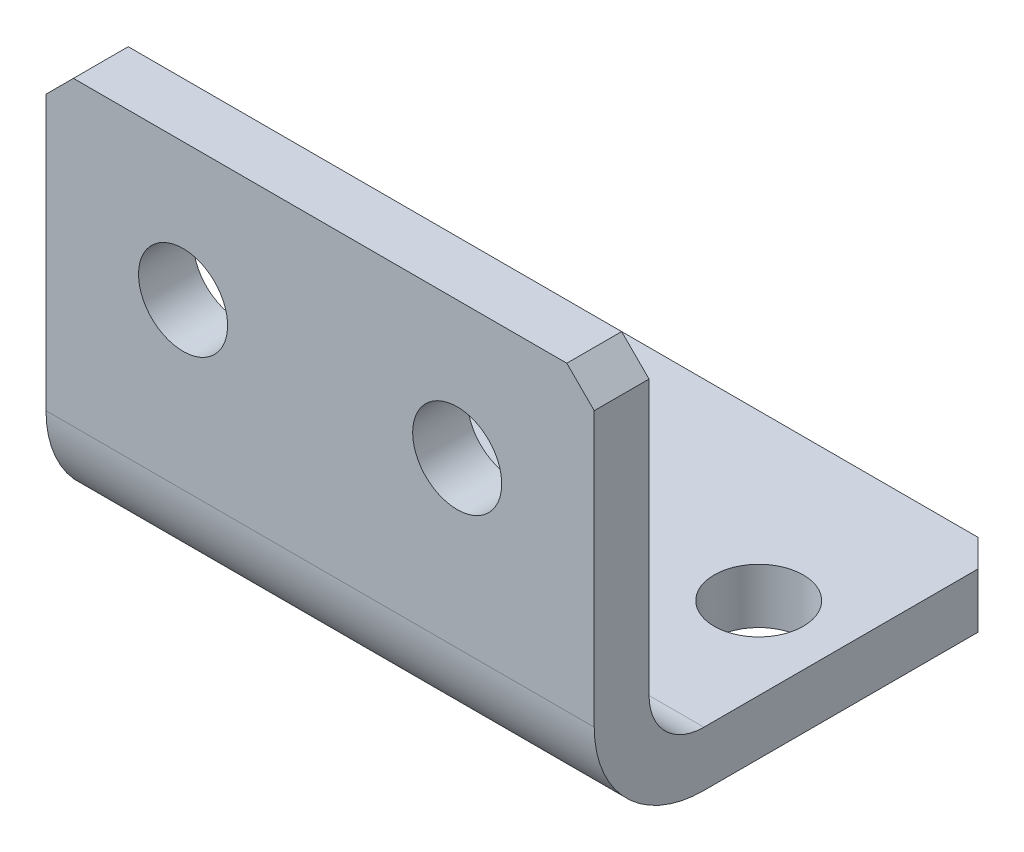
ISO-10303-21;
HEADER;
FILE_DESCRIPTION(('STEP AP214'),'2;1');
FILE_NAME('part.step','',(''),(''),'','','');
FILE_SCHEMA(('AUTOMOTIVE_DESIGN { 1 0 10303 214 1 1 1 1 }'));
ENDSEC;
DATA;
#1=APPLICATION_CONTEXT('core data for automotive mechanical design processes');
#2=APPLICATION_PROTOCOL_DEFINITION('international standard','automotive_design',2000,#1);
#3=PRODUCT_CONTEXT('',#1,'mechanical');
#4=PRODUCT('Part','Part','',(#3));
#5=PRODUCT_RELATED_PRODUCT_CATEGORY('part','',(#4));
#6=PRODUCT_DEFINITION_FORMATION('','',#4);
#7=PRODUCT_DEFINITION_CONTEXT('part definition',#1,'design');
#8=PRODUCT_DEFINITION('design','',#6,#7);
#9=PRODUCT_DEFINITION_SHAPE('','',#8);
#10=(LENGTH_UNIT() NAMED_UNIT(*) SI_UNIT(.MILLI.,.METRE.));
#11=(NAMED_UNIT(*) PLANE_ANGLE_UNIT() SI_UNIT($,.RADIAN.));
#12=(NAMED_UNIT(*) SI_UNIT($,.STERADIAN.) SOLID_ANGLE_UNIT());
#13=UNCERTAINTY_MEASURE_WITH_UNIT(LENGTH_MEASURE(1.E-05),#10,'distance_accuracy_value','');
#14=(GEOMETRIC_REPRESENTATION_CONTEXT(3) GLOBAL_UNCERTAINTY_ASSIGNED_CONTEXT((#13)) GLOBAL_UNIT_ASSIGNED_CONTEXT((#10,
#11,#12)) REPRESENTATION_CONTEXT('',''));
#15=CARTESIAN_POINT('',(0.,0.,0.));
#16=DIRECTION('',(0.,0.,1.));
#17=DIRECTION('',(1.,0.,0.));
#18=AXIS2_PLACEMENT_3D('',#15,#16,#17);
#19=CARTESIAN_POINT('',(20.,0.,-8.));
#20=DIRECTION('',(0.,1.,0.));
#21=DIRECTION('',(0.,0.,1.));
#22=AXIS2_PLACEMENT_3D('',#19,#20,#21);
#23=PLANE('',#22);
#24=CARTESIAN_POINT('',(-14.,0.,-18.));
#25=DIRECTION('',(0.,1.,0.));
#26=DIRECTION('',(0.,0.,1.));
#27=AXIS2_PLACEMENT_3D('',#24,#25,#26);
#28=CIRCLE('',#27,3.25);
#29=CARTESIAN_POINT('',(-14.,0.,-14.75));
#30=VERTEX_POINT('',#29);
#31=EDGE_CURVE('E202',#30,#30,#28,.T.);
#32=ORIENTED_EDGE('',*,*,#31,.T.);
#33=EDGE_LOOP('',(#32));
#34=FACE_BOUND('',#33,.T.);
#35=CARTESIAN_POINT('',(14.,0.,-18.));
#36=DIRECTION('',(0.,1.,0.));
#37=DIRECTION('',(0.,0.,1.));
#38=AXIS2_PLACEMENT_3D('',#35,#36,#37);
#39=CIRCLE('',#38,3.25);
#40=CARTESIAN_POINT('',(14.,0.,-14.75));
#41=VERTEX_POINT('',#40);
#42=EDGE_CURVE('E191',#41,#41,#39,.T.);
#43=ORIENTED_EDGE('',*,*,#42,.T.);
#44=EDGE_LOOP('',(#43));
#45=FACE_BOUND('',#44,.T.);
#46=DIRECTION('',(0.707106781186548,0.,-0.707106781186547));
#47=VECTOR('',#46,1.);
#48=CARTESIAN_POINT('',(-20.,0.,-28.));
#49=LINE('',#48,#47);
#50=CARTESIAN_POINT('',(-20.,0.,-28.));
#51=VERTEX_POINT('',#50);
#52=CARTESIAN_POINT('',(-18.,0.,-30.));
#53=VERTEX_POINT('',#52);
#54=EDGE_CURVE('E129',#51,#53,#49,.T.);
#55=ORIENTED_EDGE('',*,*,#54,.T.);
#56=DIRECTION('',(-1.,0.,0.));
#57=VECTOR('',#56,1.);
#58=CARTESIAN_POINT('',(20.,0.,-30.));
#59=LINE('',#58,#57);
#60=CARTESIAN_POINT('',(18.,0.,-30.));
#61=VERTEX_POINT('',#60);
#62=EDGE_CURVE('E42',#61,#53,#59,.T.);
#63=ORIENTED_EDGE('',*,*,#62,.F.);
#64=DIRECTION('',(0.707106781186548,0.,0.707106781186547));
#65=VECTOR('',#64,1.);
#66=CARTESIAN_POINT('',(18.,0.,-30.));
#67=LINE('',#66,#65);
#68=CARTESIAN_POINT('',(20.,0.,-28.));
#69=VERTEX_POINT('',#68);
#70=EDGE_CURVE('E143',#61,#69,#67,.T.);
#71=ORIENTED_EDGE('',*,*,#70,.T.);
#72=DIRECTION('',(0.,0.,-1.));
#73=VECTOR('',#72,1.);
#74=CARTESIAN_POINT('',(20.,0.,-8.));
#75=LINE('',#74,#73);
#76=CARTESIAN_POINT('',(20.,0.,-8.));
#77=VERTEX_POINT('',#76);
#78=EDGE_CURVE('E163',#77,#69,#75,.T.);
#79=ORIENTED_EDGE('',*,*,#78,.F.);
#80=DIRECTION('',(-1.,0.,0.));
#81=VECTOR('',#80,1.);
#82=CARTESIAN_POINT('',(20.,0.,-8.));
#83=LINE('',#82,#81);
#84=CARTESIAN_POINT('',(-20.,0.,-8.));
#85=VERTEX_POINT('',#84);
#86=EDGE_CURVE('E11',#77,#85,#83,.T.);
#87=ORIENTED_EDGE('',*,*,#86,.T.);
#88=DIRECTION('',(0.,0.,-1.));
#89=VECTOR('',#88,1.);
#90=CARTESIAN_POINT('',(-20.,0.,-8.));
#91=LINE('',#90,#89);
#92=EDGE_CURVE('E57',#85,#51,#91,.T.);
#93=ORIENTED_EDGE('',*,*,#92,.T.);
#94=EDGE_LOOP('',(#55,#63,#71,#79,#87,#93));
#95=FACE_BOUND('',#94,.T.);
#96=ADVANCED_FACE('F33',(#34,#45,#95),#23,.F.);
#97=CARTESIAN_POINT('',(20.,0.,-30.));
#98=DIRECTION('',(0.,0.,1.));
#99=DIRECTION('',(1.,0.,0.));
#100=AXIS2_PLACEMENT_3D('',#97,#98,#99);
#101=PLANE('',#100);
#102=DIRECTION('',(0.,-1.,0.));
#103=VECTOR('',#102,1.);
#104=CARTESIAN_POINT('',(-18.,4.,-30.));
#105=LINE('',#104,#103);
#106=CARTESIAN_POINT('',(-18.,4.,-30.));
#107=VERTEX_POINT('',#106);
#108=EDGE_CURVE('E133',#107,#53,#105,.T.);
#109=ORIENTED_EDGE('',*,*,#108,.F.);
#110=DIRECTION('',(-1.,0.,0.));
#111=VECTOR('',#110,1.);
#112=CARTESIAN_POINT('',(20.,4.,-30.));
#113=LINE('',#112,#111);
#114=CARTESIAN_POINT('',(18.,4.,-30.));
#115=VERTEX_POINT('',#114);
#116=EDGE_CURVE('E142',#115,#107,#113,.T.);
#117=ORIENTED_EDGE('',*,*,#116,.F.);
#118=DIRECTION('',(0.,-1.,0.));
#119=VECTOR('',#118,1.);
#120=CARTESIAN_POINT('',(18.,4.,-30.));
#121=LINE('',#120,#119);
#122=EDGE_CURVE('E219',#115,#61,#121,.T.);
#123=ORIENTED_EDGE('',*,*,#122,.T.);
#124=ORIENTED_EDGE('',*,*,#62,.T.);
#125=EDGE_LOOP('',(#109,#117,#123,#124));
#126=FACE_BOUND('',#125,.T.);
#127=ADVANCED_FACE('F275',(#126),#101,.F.);
#128=CARTESIAN_POINT('',(20.,4.,-30.));
#129=DIRECTION('',(0.,-1.,0.));
#130=DIRECTION('',(0.,0.,-1.));
#131=AXIS2_PLACEMENT_3D('',#128,#129,#130);
#132=PLANE('',#131);
#133=CARTESIAN_POINT('',(-14.,4.,-18.));
#134=DIRECTION('',(0.,-1.,0.));
#135=DIRECTION('',(0.,0.,-1.));
#136=AXIS2_PLACEMENT_3D('',#133,#134,#135);
#137=CIRCLE('',#136,3.25);
#138=CARTESIAN_POINT('',(-14.,4.,-21.25));
#139=VERTEX_POINT('',#138);
#140=EDGE_CURVE('E37',#139,#139,#137,.F.);
#141=ORIENTED_EDGE('',*,*,#140,.F.);
#142=EDGE_LOOP('',(#141));
#143=FACE_BOUND('',#142,.T.);
#144=CARTESIAN_POINT('',(14.,4.,-18.));
#145=DIRECTION('',(0.,-1.,0.));
#146=DIRECTION('',(0.,0.,-1.));
#147=AXIS2_PLACEMENT_3D('',#144,#145,#146);
#148=CIRCLE('',#147,3.25);
#149=CARTESIAN_POINT('',(14.,4.,-21.25));
#150=VERTEX_POINT('',#149);
#151=EDGE_CURVE('E188',#150,#150,#148,.F.);
#152=ORIENTED_EDGE('',*,*,#151,.F.);
#153=EDGE_LOOP('',(#152));
#154=FACE_BOUND('',#153,.T.);
#155=DIRECTION('',(0.707106781186548,0.,-0.707106781186547));
#156=VECTOR('',#155,1.);
#157=CARTESIAN_POINT('',(-20.,4.,-28.));
#158=LINE('',#157,#156);
#159=CARTESIAN_POINT('',(-20.,4.,-28.));
#160=VERTEX_POINT('',#159);
#161=EDGE_CURVE('E127',#160,#107,#158,.T.);
#162=ORIENTED_EDGE('',*,*,#161,.F.);
#163=DIRECTION('',(0.,0.,1.));
#164=VECTOR('',#163,1.);
#165=CARTESIAN_POINT('',(-20.,4.,-30.));
#166=LINE('',#165,#164);
#167=CARTESIAN_POINT('',(-20.,4.,-8.));
#168=VERTEX_POINT('',#167);
#169=EDGE_CURVE('E139',#160,#168,#166,.T.);
#170=ORIENTED_EDGE('',*,*,#169,.T.);
#171=DIRECTION('',(-1.,0.,0.));
#172=VECTOR('',#171,1.);
#173=CARTESIAN_POINT('',(20.,4.,-8.));
#174=LINE('',#173,#172);
#175=CARTESIAN_POINT('',(20.,4.,-8.));
#176=VERTEX_POINT('',#175);
#177=EDGE_CURVE('E184',#176,#168,#174,.T.);
#178=ORIENTED_EDGE('',*,*,#177,.F.);
#179=DIRECTION('',(0.,0.,1.));
#180=VECTOR('',#179,1.);
#181=CARTESIAN_POINT('',(20.,4.,-30.));
#182=LINE('',#181,#180);
#183=CARTESIAN_POINT('',(20.,4.,-28.));
#184=VERTEX_POINT('',#183);
#185=EDGE_CURVE('E165',#184,#176,#182,.T.);
#186=ORIENTED_EDGE('',*,*,#185,.F.);
#187=DIRECTION('',(0.707106781186548,0.,0.707106781186547));
#188=VECTOR('',#187,1.);
#189=CARTESIAN_POINT('',(18.,4.,-30.));
#190=LINE('',#189,#188);
#191=EDGE_CURVE('E50',#115,#184,#190,.T.);
#192=ORIENTED_EDGE('',*,*,#191,.F.);
#193=ORIENTED_EDGE('',*,*,#116,.T.);
#194=EDGE_LOOP('',(#162,#170,#178,#186,#192,#193));
#195=FACE_BOUND('',#194,.T.);
#196=ADVANCED_FACE('F137',(#143,#154,#195),#132,.F.);
#197=CARTESIAN_POINT('',(20.,7.99999999999993,-7.99999999999993));
#198=DIRECTION('',(1.,0.,0.));
#199=DIRECTION('',(0.,0.,-1.));
#200=AXIS2_PLACEMENT_3D('',#197,#198,#199);
#201=PLANE('',#200);
#202=ORIENTED_EDGE('',*,*,#78,.T.);
#203=DIRECTION('',(0.,-1.,0.));
#204=VECTOR('',#203,1.);
#205=CARTESIAN_POINT('',(20.,4.,-28.));
#206=LINE('',#205,#204);
#207=EDGE_CURVE('E214',#184,#69,#206,.T.);
#208=ORIENTED_EDGE('',*,*,#207,.F.);
#209=ORIENTED_EDGE('',*,*,#185,.T.);
#210=CARTESIAN_POINT('',(20.,7.99999999999993,-7.99999999999993));
#211=DIRECTION('',(-1.,0.,0.));
#212=DIRECTION('',(0.,0.,1.));
#213=AXIS2_PLACEMENT_3D('',#210,#211,#212);
#214=CIRCLE('',#213,3.99999999999993);
#215=CARTESIAN_POINT('',(20.,8.,-4.));
#216=VERTEX_POINT('',#215);
#217=EDGE_CURVE('E167',#176,#216,#214,.T.);
#218=ORIENTED_EDGE('',*,*,#217,.T.);
#219=DIRECTION('',(0.,1.,0.));
#220=VECTOR('',#219,1.);
#221=CARTESIAN_POINT('',(20.,8.,-4.));
#222=LINE('',#221,#220);
#223=CARTESIAN_POINT('',(20.,28.,-4.));
#224=VERTEX_POINT('',#223);
#225=EDGE_CURVE('E169',#216,#224,#222,.T.);
#226=ORIENTED_EDGE('',*,*,#225,.T.);
#227=DIRECTION('',(0.,0.,1.));
#228=VECTOR('',#227,1.);
#229=CARTESIAN_POINT('',(20.,28.,-4.));
#230=LINE('',#229,#228);
#231=CARTESIAN_POINT('',(20.,28.,0.));
#232=VERTEX_POINT('',#231);
#233=EDGE_CURVE('E233',#224,#232,#230,.T.);
#234=ORIENTED_EDGE('',*,*,#233,.T.);
#235=DIRECTION('',(0.,-1.,0.));
#236=VECTOR('',#235,1.);
#237=CARTESIAN_POINT('',(20.,30.,0.));
#238=LINE('',#237,#236);
#239=CARTESIAN_POINT('',(20.,8.,0.));
#240=VERTEX_POINT('',#239);
#241=EDGE_CURVE('E171',#232,#240,#238,.T.);
#242=ORIENTED_EDGE('',*,*,#241,.T.);
#243=CARTESIAN_POINT('',(20.,7.99999999999993,-7.99999999999993));
#244=DIRECTION('',(1.,0.,0.));
#245=DIRECTION('',(0.,0.,-1.));
#246=AXIS2_PLACEMENT_3D('',#243,#244,#245);
#247=CIRCLE('',#246,7.99999999999993);
#248=EDGE_CURVE('E160',#240,#77,#247,.T.);
#249=ORIENTED_EDGE('',*,*,#248,.T.);
#250=EDGE_LOOP('',(#202,#208,#209,#218,#226,#234,#242,#249));
#251=FACE_BOUND('',#250,.T.);
#252=ADVANCED_FACE('F271',(#251),#201,.T.);
#253=CARTESIAN_POINT('',(-20.,7.99999999999993,-7.99999999999993));
#254=DIRECTION('',(1.,0.,0.));
#255=DIRECTION('',(0.,0.,-1.));
#256=AXIS2_PLACEMENT_3D('',#253,#254,#255);
#257=PLANE('',#256);
#258=DIRECTION('',(0.,-1.,0.));
#259=VECTOR('',#258,1.);
#260=CARTESIAN_POINT('',(-20.,4.,-28.));
#261=LINE('',#260,#259);
#262=EDGE_CURVE('E124',#160,#51,#261,.T.);
#263=ORIENTED_EDGE('',*,*,#262,.T.);
#264=ORIENTED_EDGE('',*,*,#92,.F.);
#265=CARTESIAN_POINT('',(-20.,7.99999999999993,-7.99999999999993));
#266=DIRECTION('',(1.,0.,0.));
#267=DIRECTION('',(0.,0.,-1.));
#268=AXIS2_PLACEMENT_3D('',#265,#266,#267);
#269=CIRCLE('',#268,7.99999999999993);
#270=CARTESIAN_POINT('',(-20.,8.,0.));
#271=VERTEX_POINT('',#270);
#272=EDGE_CURVE('E153',#271,#85,#269,.T.);
#273=ORIENTED_EDGE('',*,*,#272,.F.);
#274=DIRECTION('',(0.,-1.,0.));
#275=VECTOR('',#274,1.);
#276=CARTESIAN_POINT('',(-20.,30.,0.));
#277=LINE('',#276,#275);
#278=CARTESIAN_POINT('',(-20.,28.,0.));
#279=VERTEX_POINT('',#278);
#280=EDGE_CURVE('E158',#279,#271,#277,.T.);
#281=ORIENTED_EDGE('',*,*,#280,.F.);
#282=DIRECTION('',(0.,0.,1.));
#283=VECTOR('',#282,1.);
#284=CARTESIAN_POINT('',(-20.,28.,-4.));
#285=LINE('',#284,#283);
#286=CARTESIAN_POINT('',(-20.,28.,-4.));
#287=VERTEX_POINT('',#286);
#288=EDGE_CURVE('E230',#287,#279,#285,.T.);
#289=ORIENTED_EDGE('',*,*,#288,.F.);
#290=DIRECTION('',(0.,1.,0.));
#291=VECTOR('',#290,1.);
#292=CARTESIAN_POINT('',(-20.,8.,-4.));
#293=LINE('',#292,#291);
#294=CARTESIAN_POINT('',(-20.,8.,-4.));
#295=VERTEX_POINT('',#294);
#296=EDGE_CURVE('E151',#295,#287,#293,.T.);
#297=ORIENTED_EDGE('',*,*,#296,.F.);
#298=CARTESIAN_POINT('',(-20.,7.99999999999993,-7.99999999999993));
#299=DIRECTION('',(-1.,0.,0.));
#300=DIRECTION('',(0.,0.,1.));
#301=AXIS2_PLACEMENT_3D('',#298,#299,#300);
#302=CIRCLE('',#301,3.99999999999993);
#303=EDGE_CURVE('E149',#168,#295,#302,.T.);
#304=ORIENTED_EDGE('',*,*,#303,.F.);
#305=ORIENTED_EDGE('',*,*,#169,.F.);
#306=EDGE_LOOP('',(#263,#264,#273,#281,#289,#297,#304,#305));
#307=FACE_BOUND('',#306,.T.);
#308=ADVANCED_FACE('F146',(#307),#257,.F.);
#309=CARTESIAN_POINT('',(20.,7.99999999999993,-7.99999999999993));
#310=DIRECTION('',(-1.,0.,0.));
#311=DIRECTION('',(0.,0.,1.));
#312=AXIS2_PLACEMENT_3D('',#309,#310,#311);
#313=CYLINDRICAL_SURFACE('',#312,7.99999999999993);
#314=DIRECTION('',(-1.,0.,0.));
#315=VECTOR('',#314,1.);
#316=CARTESIAN_POINT('',(20.,8.,0.));
#317=LINE('',#316,#315);
#318=EDGE_CURVE('E173',#240,#271,#317,.T.);
#319=ORIENTED_EDGE('',*,*,#318,.T.);
#320=ORIENTED_EDGE('',*,*,#272,.T.);
#321=ORIENTED_EDGE('',*,*,#86,.F.);
#322=ORIENTED_EDGE('',*,*,#248,.F.);
#323=EDGE_LOOP('',(#319,#320,#321,#322));
#324=FACE_BOUND('',#323,.T.);
#325=ADVANCED_FACE('F35',(#324),#313,.T.);
#326=CARTESIAN_POINT('',(20.,7.99999999999993,-7.99999999999993));
#327=DIRECTION('',(-1.,0.,0.));
#328=DIRECTION('',(0.,0.,1.));
#329=AXIS2_PLACEMENT_3D('',#326,#327,#328);
#330=CYLINDRICAL_SURFACE('',#329,3.99999999999993);
#331=ORIENTED_EDGE('',*,*,#177,.T.);
#332=ORIENTED_EDGE('',*,*,#303,.T.);
#333=DIRECTION('',(-1.,0.,0.));
#334=VECTOR('',#333,1.);
#335=CARTESIAN_POINT('',(20.,8.,-4.));
#336=LINE('',#335,#334);
#337=EDGE_CURVE('E182',#216,#295,#336,.T.);
#338=ORIENTED_EDGE('',*,*,#337,.F.);
#339=ORIENTED_EDGE('',*,*,#217,.F.);
#340=EDGE_LOOP('',(#331,#332,#338,#339));
#341=FACE_BOUND('',#340,.T.);
#342=ADVANCED_FACE('F267',(#341),#330,.F.);
#343=CARTESIAN_POINT('',(20.,8.,-4.));
#344=DIRECTION('',(0.,0.,1.));
#345=DIRECTION('',(1.,0.,0.));
#346=AXIS2_PLACEMENT_3D('',#343,#344,#345);
#347=PLANE('',#346);
#348=CARTESIAN_POINT('',(-10.,20.,-4.));
#349=DIRECTION('',(0.,0.,1.));
#350=DIRECTION('',(1.,0.,0.));
#351=AXIS2_PLACEMENT_3D('',#348,#349,#350);
#352=CIRCLE('',#351,3.25);
#353=CARTESIAN_POINT('',(-6.75,20.,-4.));
#354=VERTEX_POINT('',#353);
#355=EDGE_CURVE('E195',#354,#354,#352,.F.);
#356=ORIENTED_EDGE('',*,*,#355,.F.);
#357=EDGE_LOOP('',(#356));
#358=FACE_BOUND('',#357,.T.);
#359=CARTESIAN_POINT('',(10.,20.,-4.));
#360=DIRECTION('',(0.,0.,1.));
#361=DIRECTION('',(1.,0.,0.));
#362=AXIS2_PLACEMENT_3D('',#359,#360,#361);
#363=CIRCLE('',#362,3.25);
#364=CARTESIAN_POINT('',(13.25,20.,-4.));
#365=VERTEX_POINT('',#364);
#366=EDGE_CURVE('E210',#365,#365,#363,.F.);
#367=ORIENTED_EDGE('',*,*,#366,.F.);
#368=EDGE_LOOP('',(#367));
#369=FACE_BOUND('',#368,.T.);
#370=DIRECTION('',(-1.,0.,0.));
#371=VECTOR('',#370,1.);
#372=CARTESIAN_POINT('',(20.,30.,-4.));
#373=LINE('',#372,#371);
#374=CARTESIAN_POINT('',(18.,30.,-4.));
#375=VERTEX_POINT('',#374);
#376=CARTESIAN_POINT('',(-18.,30.,-4.));
#377=VERTEX_POINT('',#376);
#378=EDGE_CURVE('E179',#375,#377,#373,.T.);
#379=ORIENTED_EDGE('',*,*,#378,.F.);
#380=DIRECTION('',(0.707106781186548,-0.707106781186547,0.));
#381=VECTOR('',#380,1.);
#382=CARTESIAN_POINT('',(18.,30.,-4.));
#383=LINE('',#382,#381);
#384=EDGE_CURVE('E226',#375,#224,#383,.T.);
#385=ORIENTED_EDGE('',*,*,#384,.T.);
#386=ORIENTED_EDGE('',*,*,#225,.F.);
#387=ORIENTED_EDGE('',*,*,#337,.T.);
#388=ORIENTED_EDGE('',*,*,#296,.T.);
#389=DIRECTION('',(0.707106781186548,0.707106781186547,0.));
#390=VECTOR('',#389,1.);
#391=CARTESIAN_POINT('',(-20.,28.,-4.));
#392=LINE('',#391,#390);
#393=EDGE_CURVE('E223',#287,#377,#392,.T.);
#394=ORIENTED_EDGE('',*,*,#393,.T.);
#395=EDGE_LOOP('',(#379,#385,#386,#387,#388,#394));
#396=FACE_BOUND('',#395,.T.);
#397=ADVANCED_FACE('F263',(#358,#369,#396),#347,.F.);
#398=CARTESIAN_POINT('',(20.,30.,-4.));
#399=DIRECTION('',(0.,-1.,0.));
#400=DIRECTION('',(0.,0.,-1.));
#401=AXIS2_PLACEMENT_3D('',#398,#399,#400);
#402=PLANE('',#401);
#403=DIRECTION('',(-1.,0.,0.));
#404=VECTOR('',#403,1.);
#405=CARTESIAN_POINT('',(20.,30.,0.));
#406=LINE('',#405,#404);
#407=CARTESIAN_POINT('',(18.,30.,0.));
#408=VERTEX_POINT('',#407);
#409=CARTESIAN_POINT('',(-18.,30.,0.));
#410=VERTEX_POINT('',#409);
#411=EDGE_CURVE('E176',#408,#410,#406,.T.);
#412=ORIENTED_EDGE('',*,*,#411,.F.);
#413=DIRECTION('',(0.,0.,1.));
#414=VECTOR('',#413,1.);
#415=CARTESIAN_POINT('',(18.,30.,-4.));
#416=LINE('',#415,#414);
#417=EDGE_CURVE('E236',#375,#408,#416,.T.);
#418=ORIENTED_EDGE('',*,*,#417,.F.);
#419=ORIENTED_EDGE('',*,*,#378,.T.);
#420=DIRECTION('',(0.,0.,1.));
#421=VECTOR('',#420,1.);
#422=CARTESIAN_POINT('',(-18.,30.,-4.));
#423=LINE('',#422,#421);
#424=EDGE_CURVE('E238',#377,#410,#423,.T.);
#425=ORIENTED_EDGE('',*,*,#424,.T.);
#426=EDGE_LOOP('',(#412,#418,#419,#425));
#427=FACE_BOUND('',#426,.T.);
#428=ADVANCED_FACE('F259',(#427),#402,.F.);
#429=CARTESIAN_POINT('',(20.,30.,0.));
#430=DIRECTION('',(0.,0.,-1.));
#431=DIRECTION('',(-1.,0.,0.));
#432=AXIS2_PLACEMENT_3D('',#429,#430,#431);
#433=PLANE('',#432);
#434=CARTESIAN_POINT('',(-10.,20.,0.));
#435=DIRECTION('',(0.,0.,-1.));
#436=DIRECTION('',(-1.,0.,0.));
#437=AXIS2_PLACEMENT_3D('',#434,#435,#436);
#438=CIRCLE('',#437,3.25);
#439=CARTESIAN_POINT('',(-13.25,20.,0.));
#440=VERTEX_POINT('',#439);
#441=EDGE_CURVE('E190',#440,#440,#438,.T.);
#442=ORIENTED_EDGE('',*,*,#441,.T.);
#443=EDGE_LOOP('',(#442));
#444=FACE_BOUND('',#443,.T.);
#445=CARTESIAN_POINT('',(10.,20.,0.));
#446=DIRECTION('',(0.,0.,-1.));
#447=DIRECTION('',(-1.,0.,0.));
#448=AXIS2_PLACEMENT_3D('',#445,#446,#447);
#449=CIRCLE('',#448,3.25);
#450=CARTESIAN_POINT('',(6.75,20.,0.));
#451=VERTEX_POINT('',#450);
#452=EDGE_CURVE('E207',#451,#451,#449,.T.);
#453=ORIENTED_EDGE('',*,*,#452,.T.);
#454=EDGE_LOOP('',(#453));
#455=FACE_BOUND('',#454,.T.);
#456=ORIENTED_EDGE('',*,*,#241,.F.);
#457=DIRECTION('',(0.707106781186548,-0.707106781186547,0.));
#458=VECTOR('',#457,1.);
#459=CARTESIAN_POINT('',(18.,30.,0.));
#460=LINE('',#459,#458);
#461=EDGE_CURVE('E227',#408,#232,#460,.T.);
#462=ORIENTED_EDGE('',*,*,#461,.F.);
#463=ORIENTED_EDGE('',*,*,#411,.T.);
#464=DIRECTION('',(0.707106781186548,0.707106781186547,0.));
#465=VECTOR('',#464,1.);
#466=CARTESIAN_POINT('',(-20.,28.,0.));
#467=LINE('',#466,#465);
#468=EDGE_CURVE('E132',#279,#410,#467,.T.);
#469=ORIENTED_EDGE('',*,*,#468,.F.);
#470=ORIENTED_EDGE('',*,*,#280,.T.);
#471=ORIENTED_EDGE('',*,*,#318,.F.);
#472=EDGE_LOOP('',(#456,#462,#463,#469,#470,#471));
#473=FACE_BOUND('',#472,.T.);
#474=ADVANCED_FACE('F252',(#444,#455,#473),#433,.F.);
#475=CARTESIAN_POINT('',(-20.,28.,-4.));
#476=DIRECTION('',(0.707106781186547,-0.707106781186548,0.));
#477=DIRECTION('',(0.707106781186548,0.707106781186547,0.));
#478=AXIS2_PLACEMENT_3D('',#475,#476,#477);
#479=PLANE('',#478);
#480=ORIENTED_EDGE('',*,*,#468,.T.);
#481=ORIENTED_EDGE('',*,*,#424,.F.);
#482=ORIENTED_EDGE('',*,*,#393,.F.);
#483=ORIENTED_EDGE('',*,*,#288,.T.);
#484=EDGE_LOOP('',(#480,#481,#482,#483));
#485=FACE_BOUND('',#484,.T.);
#486=ADVANCED_FACE('F256',(#485),#479,.F.);
#487=CARTESIAN_POINT('',(18.,30.,-4.));
#488=DIRECTION('',(-0.707106781186547,-0.707106781186548,0.));
#489=DIRECTION('',(0.707106781186548,-0.707106781186547,0.));
#490=AXIS2_PLACEMENT_3D('',#487,#488,#489);
#491=PLANE('',#490);
#492=ORIENTED_EDGE('',*,*,#461,.T.);
#493=ORIENTED_EDGE('',*,*,#233,.F.);
#494=ORIENTED_EDGE('',*,*,#384,.F.);
#495=ORIENTED_EDGE('',*,*,#417,.T.);
#496=EDGE_LOOP('',(#492,#493,#494,#495));
#497=FACE_BOUND('',#496,.T.);
#498=ADVANCED_FACE('F302',(#497),#491,.F.);
#499=CARTESIAN_POINT('',(-20.,4.,-28.));
#500=DIRECTION('',(-0.707106781186547,0.,-0.707106781186548));
#501=DIRECTION('',(-0.707106781186548,0.,0.707106781186547));
#502=AXIS2_PLACEMENT_3D('',#499,#500,#501);
#503=PLANE('',#502);
#504=ORIENTED_EDGE('',*,*,#54,.F.);
#505=ORIENTED_EDGE('',*,*,#262,.F.);
#506=ORIENTED_EDGE('',*,*,#161,.T.);
#507=ORIENTED_EDGE('',*,*,#108,.T.);
#508=EDGE_LOOP('',(#504,#505,#506,#507));
#509=FACE_BOUND('',#508,.T.);
#510=ADVANCED_FACE('F126',(#509),#503,.T.);
#511=CARTESIAN_POINT('',(18.,4.,-30.));
#512=DIRECTION('',(0.707106781186547,0.,-0.707106781186548));
#513=DIRECTION('',(-0.707106781186548,0.,-0.707106781186547));
#514=AXIS2_PLACEMENT_3D('',#511,#512,#513);
#515=PLANE('',#514);
#516=ORIENTED_EDGE('',*,*,#70,.F.);
#517=ORIENTED_EDGE('',*,*,#122,.F.);
#518=ORIENTED_EDGE('',*,*,#191,.T.);
#519=ORIENTED_EDGE('',*,*,#207,.T.);
#520=EDGE_LOOP('',(#516,#517,#518,#519));
#521=FACE_BOUND('',#520,.T.);
#522=ADVANCED_FACE('F272',(#521),#515,.T.);
#523=CARTESIAN_POINT('',(10.,20.,0.));
#524=DIRECTION('',(0.,0.,-1.));
#525=DIRECTION('',(-1.,0.,0.));
#526=AXIS2_PLACEMENT_3D('',#523,#524,#525);
#527=CYLINDRICAL_SURFACE('',#526,3.25);
#528=ORIENTED_EDGE('',*,*,#452,.F.);
#529=EDGE_LOOP('',(#528));
#530=FACE_BOUND('',#529,.T.);
#531=ORIENTED_EDGE('',*,*,#366,.T.);
#532=EDGE_LOOP('',(#531));
#533=FACE_BOUND('',#532,.T.);
#534=ADVANCED_FACE('F310',(#530,#533),#527,.F.);
#535=CARTESIAN_POINT('',(-10.,20.,0.));
#536=DIRECTION('',(0.,0.,-1.));
#537=DIRECTION('',(-1.,0.,0.));
#538=AXIS2_PLACEMENT_3D('',#535,#536,#537);
#539=CYLINDRICAL_SURFACE('',#538,3.25);
#540=ORIENTED_EDGE('',*,*,#441,.F.);
#541=EDGE_LOOP('',(#540));
#542=FACE_BOUND('',#541,.T.);
#543=ORIENTED_EDGE('',*,*,#355,.T.);
#544=EDGE_LOOP('',(#543));
#545=FACE_BOUND('',#544,.T.);
#546=ADVANCED_FACE('F313',(#542,#545),#539,.F.);
#547=CARTESIAN_POINT('',(14.,0.,-18.));
#548=DIRECTION('',(0.,1.,0.));
#549=DIRECTION('',(0.,0.,1.));
#550=AXIS2_PLACEMENT_3D('',#547,#548,#549);
#551=CYLINDRICAL_SURFACE('',#550,3.25);
#552=ORIENTED_EDGE('',*,*,#42,.F.);
#553=EDGE_LOOP('',(#552));
#554=FACE_BOUND('',#553,.T.);
#555=ORIENTED_EDGE('',*,*,#151,.T.);
#556=EDGE_LOOP('',(#555));
#557=FACE_BOUND('',#556,.T.);
#558=ADVANCED_FACE('F317',(#554,#557),#551,.F.);
#559=CARTESIAN_POINT('',(-14.,0.,-18.));
#560=DIRECTION('',(0.,1.,0.));
#561=DIRECTION('',(0.,0.,1.));
#562=AXIS2_PLACEMENT_3D('',#559,#560,#561);
#563=CYLINDRICAL_SURFACE('',#562,3.25);
#564=ORIENTED_EDGE('',*,*,#31,.F.);
#565=EDGE_LOOP('',(#564));
#566=FACE_BOUND('',#565,.T.);
#567=ORIENTED_EDGE('',*,*,#140,.T.);
#568=EDGE_LOOP('',(#567));
#569=FACE_BOUND('',#568,.T.);
#570=ADVANCED_FACE('F321',(#566,#569),#563,.F.);
#571=CLOSED_SHELL('',(#96,#127,#196,#252,#308,#325,#342,#397,#428,#474,#486,#498,#510,#522,#534,
#546,#558,#570));
#572=MANIFOLD_SOLID_BREP('B2',#571);
#573=ADVANCED_BREP_SHAPE_REPRESENTATION('',(#18,#572),#14);
#574=SHAPE_DEFINITION_REPRESENTATION(#9,#573);
ENDSEC;
END-ISO-10303-21;
